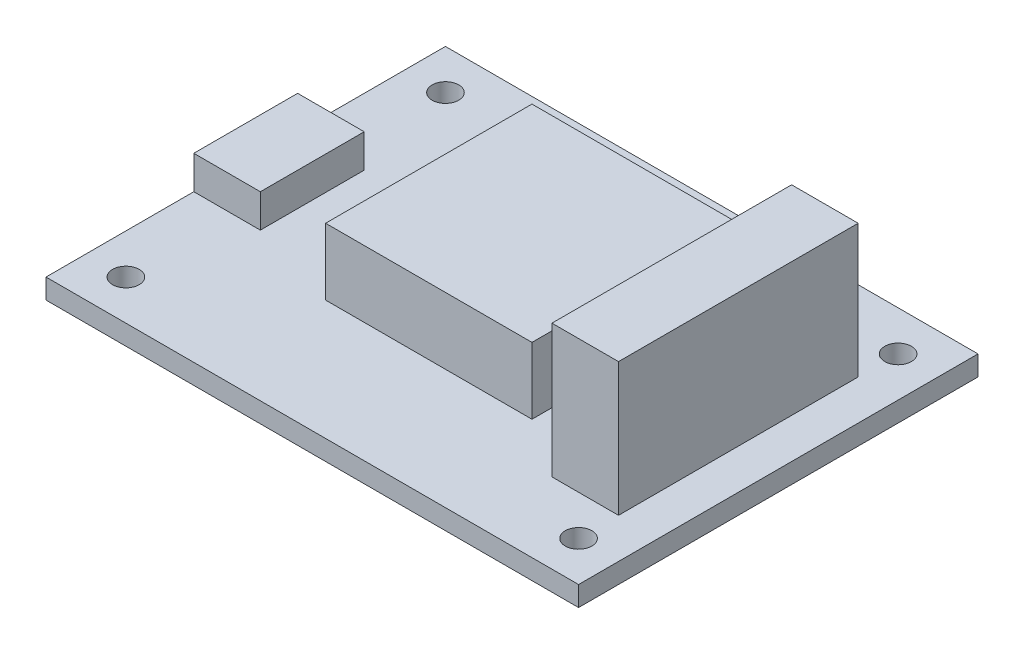
ISO-10303-21;
HEADER;
FILE_DESCRIPTION(('STEP AP214'),'2;1');
FILE_NAME('part.step','',(''),(''),'','','');
FILE_SCHEMA(('AUTOMOTIVE_DESIGN { 1 0 10303 214 1 1 1 1 }'));
ENDSEC;
DATA;
#1=APPLICATION_CONTEXT('core data for automotive mechanical design processes');
#2=APPLICATION_PROTOCOL_DEFINITION('international standard','automotive_design',2000,#1);
#3=PRODUCT_CONTEXT('',#1,'mechanical');
#4=PRODUCT('Part','Part','',(#3));
#5=PRODUCT_RELATED_PRODUCT_CATEGORY('part','',(#4));
#6=PRODUCT_DEFINITION_FORMATION('','',#4);
#7=PRODUCT_DEFINITION_CONTEXT('part definition',#1,'design');
#8=PRODUCT_DEFINITION('design','',#6,#7);
#9=PRODUCT_DEFINITION_SHAPE('','',#8);
#10=(LENGTH_UNIT() NAMED_UNIT(*) SI_UNIT(.MILLI.,.METRE.));
#11=(NAMED_UNIT(*) PLANE_ANGLE_UNIT() SI_UNIT($,.RADIAN.));
#12=(NAMED_UNIT(*) SI_UNIT($,.STERADIAN.) SOLID_ANGLE_UNIT());
#13=UNCERTAINTY_MEASURE_WITH_UNIT(LENGTH_MEASURE(1.E-05),#10,'distance_accuracy_value','');
#14=(GEOMETRIC_REPRESENTATION_CONTEXT(3) GLOBAL_UNCERTAINTY_ASSIGNED_CONTEXT((#13)) GLOBAL_UNIT_ASSIGNED_CONTEXT((#10,
#11,#12)) REPRESENTATION_CONTEXT('',''));
#15=CARTESIAN_POINT('',(0.,0.,0.));
#16=DIRECTION('',(0.,0.,1.));
#17=DIRECTION('',(1.,0.,0.));
#18=AXIS2_PLACEMENT_3D('',#15,#16,#17);
#19=CARTESIAN_POINT('',(0.,1.5,0.));
#20=DIRECTION('',(0.,-1.,0.));
#21=DIRECTION('',(0.,0.,-1.));
#22=AXIS2_PLACEMENT_3D('',#19,#20,#21);
#23=PLANE('',#22);
#24=DIRECTION('',(0.,0.,1.));
#25=VECTOR('',#24,1.);
#26=CARTESIAN_POINT('',(-8.,1.5,-9.5));
#27=LINE('',#26,#25);
#28=CARTESIAN_POINT('',(-8.,1.5,-9.5));
#29=VERTEX_POINT('',#28);
#30=CARTESIAN_POINT('',(-7.99999999999999,1.5,6.));
#31=VERTEX_POINT('',#30);
#32=EDGE_CURVE('E170',#29,#31,#27,.T.);
#33=ORIENTED_EDGE('',*,*,#32,.F.);
#34=DIRECTION('',(-1.,0.,0.));
#35=VECTOR('',#34,1.);
#36=CARTESIAN_POINT('',(-8.,1.5,-9.5));
#37=LINE('',#36,#35);
#38=CARTESIAN_POINT('',(7.5,1.5,-9.5));
#39=VERTEX_POINT('',#38);
#40=EDGE_CURVE('E183',#39,#29,#37,.T.);
#41=ORIENTED_EDGE('',*,*,#40,.F.);
#42=DIRECTION('',(0.,0.,-1.));
#43=VECTOR('',#42,1.);
#44=CARTESIAN_POINT('',(7.5,1.5,-9.5));
#45=LINE('',#44,#43);
#46=CARTESIAN_POINT('',(7.50000000000001,1.5,6.));
#47=VERTEX_POINT('',#46);
#48=EDGE_CURVE('E192',#47,#39,#45,.T.);
#49=ORIENTED_EDGE('',*,*,#48,.F.);
#50=DIRECTION('',(1.,0.,0.));
#51=VECTOR('',#50,1.);
#52=CARTESIAN_POINT('',(-7.99999999999999,1.5,6.));
#53=LINE('',#52,#51);
#54=EDGE_CURVE('E173',#31,#47,#53,.T.);
#55=ORIENTED_EDGE('',*,*,#54,.F.);
#56=EDGE_LOOP('',(#33,#41,#49,#55));
#57=FACE_BOUND('',#56,.T.);
#58=CARTESIAN_POINT('',(-17.,1.5,12.));
#59=DIRECTION('',(0.,1.,0.));
#60=DIRECTION('',(0.,0.,-1.));
#61=AXIS2_PLACEMENT_3D('',#58,#59,#60);
#62=CIRCLE('',#61,1.);
#63=CARTESIAN_POINT('',(-17.,1.5,11.));
#64=VERTEX_POINT('',#63);
#65=EDGE_CURVE('E239',#64,#64,#62,.T.);
#66=ORIENTED_EDGE('',*,*,#65,.F.);
#67=EDGE_LOOP('',(#66));
#68=FACE_BOUND('',#67,.T.);
#69=CARTESIAN_POINT('',(17.,1.5,12.));
#70=DIRECTION('',(0.,1.,0.));
#71=DIRECTION('',(0.,0.,1.));
#72=AXIS2_PLACEMENT_3D('',#69,#70,#71);
#73=CIRCLE('',#72,1.);
#74=CARTESIAN_POINT('',(17.,1.5,13.));
#75=VERTEX_POINT('',#74);
#76=EDGE_CURVE('E245',#75,#75,#73,.T.);
#77=ORIENTED_EDGE('',*,*,#76,.F.);
#78=EDGE_LOOP('',(#77));
#79=FACE_BOUND('',#78,.T.);
#80=CARTESIAN_POINT('',(17.,1.5,-12.));
#81=DIRECTION('',(0.,1.,0.));
#82=DIRECTION('',(0.,0.,-1.));
#83=AXIS2_PLACEMENT_3D('',#80,#81,#82);
#84=CIRCLE('',#83,1.);
#85=CARTESIAN_POINT('',(17.,1.5,-13.));
#86=VERTEX_POINT('',#85);
#87=EDGE_CURVE('E251',#86,#86,#84,.T.);
#88=ORIENTED_EDGE('',*,*,#87,.F.);
#89=EDGE_LOOP('',(#88));
#90=FACE_BOUND('',#89,.T.);
#91=CARTESIAN_POINT('',(-17.,1.5,-12.));
#92=DIRECTION('',(0.,1.,0.));
#93=DIRECTION('',(0.,0.,1.));
#94=AXIS2_PLACEMENT_3D('',#91,#92,#93);
#95=CIRCLE('',#94,1.);
#96=CARTESIAN_POINT('',(-17.,1.5,-11.));
#97=VERTEX_POINT('',#96);
#98=EDGE_CURVE('E257',#97,#97,#95,.T.);
#99=ORIENTED_EDGE('',*,*,#98,.F.);
#100=EDGE_LOOP('',(#99));
#101=FACE_BOUND('',#100,.T.);
#102=DIRECTION('',(-1.,0.,0.));
#103=VECTOR('',#102,1.);
#104=CARTESIAN_POINT('',(-20.,1.5,-3.89999999999999));
#105=LINE('',#104,#103);
#106=CARTESIAN_POINT('',(-15.,1.5,-3.90000000000001));
#107=VERTEX_POINT('',#106);
#108=CARTESIAN_POINT('',(-20.,1.5,-3.9));
#109=VERTEX_POINT('',#108);
#110=EDGE_CURVE('E213',#107,#109,#105,.T.);
#111=ORIENTED_EDGE('',*,*,#110,.F.);
#112=DIRECTION('',(0.,0.,-1.));
#113=VECTOR('',#112,1.);
#114=CARTESIAN_POINT('',(-15.,1.5,-3.90000000000001));
#115=LINE('',#114,#113);
#116=CARTESIAN_POINT('',(-15.,1.5,3.89999999999999));
#117=VERTEX_POINT('',#116);
#118=EDGE_CURVE('E222',#117,#107,#115,.T.);
#119=ORIENTED_EDGE('',*,*,#118,.F.);
#120=DIRECTION('',(1.,0.,0.));
#121=VECTOR('',#120,1.);
#122=CARTESIAN_POINT('',(-20.,1.5,3.89999999999999));
#123=LINE('',#122,#121);
#124=CARTESIAN_POINT('',(-20.,1.5,3.89999999999999));
#125=VERTEX_POINT('',#124);
#126=EDGE_CURVE('E208',#125,#117,#123,.T.);
#127=ORIENTED_EDGE('',*,*,#126,.F.);
#128=DIRECTION('',(0.,0.,1.));
#129=VECTOR('',#128,1.);
#130=CARTESIAN_POINT('',(-20.,1.5,15.));
#131=LINE('',#130,#129);
#132=CARTESIAN_POINT('',(-20.,1.5,15.));
#133=VERTEX_POINT('',#132);
#134=EDGE_CURVE('E269',#125,#133,#131,.T.);
#135=ORIENTED_EDGE('',*,*,#134,.T.);
#136=DIRECTION('',(1.,0.,0.));
#137=VECTOR('',#136,1.);
#138=CARTESIAN_POINT('',(-20.,1.5,15.));
#139=LINE('',#138,#137);
#140=CARTESIAN_POINT('',(20.,1.5,15.));
#141=VERTEX_POINT('',#140);
#142=EDGE_CURVE('E272',#133,#141,#139,.T.);
#143=ORIENTED_EDGE('',*,*,#142,.T.);
#144=DIRECTION('',(0.,0.,-1.));
#145=VECTOR('',#144,1.);
#146=CARTESIAN_POINT('',(20.,1.5,15.));
#147=LINE('',#146,#145);
#148=CARTESIAN_POINT('',(20.,1.5,-15.));
#149=VERTEX_POINT('',#148);
#150=EDGE_CURVE('E263',#141,#149,#147,.T.);
#151=ORIENTED_EDGE('',*,*,#150,.T.);
#152=DIRECTION('',(-1.,0.,0.));
#153=VECTOR('',#152,1.);
#154=CARTESIAN_POINT('',(-20.,1.5,-15.));
#155=LINE('',#154,#153);
#156=CARTESIAN_POINT('',(-20.,1.5,-15.));
#157=VERTEX_POINT('',#156);
#158=EDGE_CURVE('E266',#149,#157,#155,.T.);
#159=ORIENTED_EDGE('',*,*,#158,.T.);
#160=EDGE_CURVE('E270',#157,#109,#131,.T.);
#161=ORIENTED_EDGE('',*,*,#160,.T.);
#162=EDGE_LOOP('',(#111,#119,#127,#135,#143,#151,#159,#161));
#163=FACE_BOUND('',#162,.T.);
#164=DIRECTION('',(0.,0.,1.));
#165=VECTOR('',#164,1.);
#166=CARTESIAN_POINT('',(12.,1.5,-9.));
#167=LINE('',#166,#165);
#168=CARTESIAN_POINT('',(12.,1.5,-9.));
#169=VERTEX_POINT('',#168);
#170=CARTESIAN_POINT('',(12.,1.5,9.));
#171=VERTEX_POINT('',#170);
#172=EDGE_CURVE('E169',#169,#171,#167,.T.);
#173=ORIENTED_EDGE('',*,*,#172,.F.);
#174=DIRECTION('',(-1.,0.,0.));
#175=VECTOR('',#174,1.);
#176=CARTESIAN_POINT('',(12.,1.5,-9.));
#177=LINE('',#176,#175);
#178=CARTESIAN_POINT('',(17.,1.5,-9.));
#179=VERTEX_POINT('',#178);
#180=EDGE_CURVE('E166',#179,#169,#177,.T.);
#181=ORIENTED_EDGE('',*,*,#180,.F.);
#182=DIRECTION('',(0.,0.,-1.));
#183=VECTOR('',#182,1.);
#184=CARTESIAN_POINT('',(17.,1.5,-9.));
#185=LINE('',#184,#183);
#186=CARTESIAN_POINT('',(17.,1.5,9.));
#187=VERTEX_POINT('',#186);
#188=EDGE_CURVE('E56',#187,#179,#185,.T.);
#189=ORIENTED_EDGE('',*,*,#188,.F.);
#190=DIRECTION('',(1.,0.,0.));
#191=VECTOR('',#190,1.);
#192=CARTESIAN_POINT('',(12.,1.5,9.));
#193=LINE('',#192,#191);
#194=EDGE_CURVE('E51',#171,#187,#193,.T.);
#195=ORIENTED_EDGE('',*,*,#194,.F.);
#196=EDGE_LOOP('',(#173,#181,#189,#195));
#197=FACE_BOUND('',#196,.T.);
#198=ADVANCED_FACE('F36',(#57,#68,#79,#90,#101,#163,#197),#23,.F.);
#199=CARTESIAN_POINT('',(0.,0.,0.));
#200=DIRECTION('',(0.,-1.,0.));
#201=DIRECTION('',(0.,0.,-1.));
#202=AXIS2_PLACEMENT_3D('',#199,#200,#201);
#203=PLANE('',#202);
#204=CARTESIAN_POINT('',(17.,0.,12.));
#205=DIRECTION('',(0.,1.,0.));
#206=DIRECTION('',(0.,0.,1.));
#207=AXIS2_PLACEMENT_3D('',#204,#205,#206);
#208=CIRCLE('',#207,1.);
#209=CARTESIAN_POINT('',(17.,0.,13.));
#210=VERTEX_POINT('',#209);
#211=EDGE_CURVE('E242',#210,#210,#208,.T.);
#212=ORIENTED_EDGE('',*,*,#211,.T.);
#213=EDGE_LOOP('',(#212));
#214=FACE_BOUND('',#213,.T.);
#215=CARTESIAN_POINT('',(-17.,0.,-12.));
#216=DIRECTION('',(0.,1.,0.));
#217=DIRECTION('',(0.,0.,1.));
#218=AXIS2_PLACEMENT_3D('',#215,#216,#217);
#219=CIRCLE('',#218,1.);
#220=CARTESIAN_POINT('',(-17.,0.,-11.));
#221=VERTEX_POINT('',#220);
#222=EDGE_CURVE('E254',#221,#221,#219,.T.);
#223=ORIENTED_EDGE('',*,*,#222,.T.);
#224=EDGE_LOOP('',(#223));
#225=FACE_BOUND('',#224,.T.);
#226=DIRECTION('',(0.,0.,-1.));
#227=VECTOR('',#226,1.);
#228=CARTESIAN_POINT('',(20.,0.,15.));
#229=LINE('',#228,#227);
#230=CARTESIAN_POINT('',(20.,0.,15.));
#231=VERTEX_POINT('',#230);
#232=CARTESIAN_POINT('',(20.,0.,-15.));
#233=VERTEX_POINT('',#232);
#234=EDGE_CURVE('E260',#231,#233,#229,.T.);
#235=ORIENTED_EDGE('',*,*,#234,.F.);
#236=DIRECTION('',(1.,0.,0.));
#237=VECTOR('',#236,1.);
#238=CARTESIAN_POINT('',(-20.,0.,15.));
#239=LINE('',#238,#237);
#240=CARTESIAN_POINT('',(-20.,0.,15.));
#241=VERTEX_POINT('',#240);
#242=EDGE_CURVE('E267',#241,#231,#239,.T.);
#243=ORIENTED_EDGE('',*,*,#242,.F.);
#244=DIRECTION('',(0.,0.,1.));
#245=VECTOR('',#244,1.);
#246=CARTESIAN_POINT('',(-20.,0.,15.));
#247=LINE('',#246,#245);
#248=CARTESIAN_POINT('',(-20.,0.,-15.));
#249=VERTEX_POINT('',#248);
#250=EDGE_CURVE('E279',#249,#241,#247,.T.);
#251=ORIENTED_EDGE('',*,*,#250,.F.);
#252=DIRECTION('',(-1.,0.,0.));
#253=VECTOR('',#252,1.);
#254=CARTESIAN_POINT('',(-20.,0.,-15.));
#255=LINE('',#254,#253);
#256=EDGE_CURVE('E277',#233,#249,#255,.T.);
#257=ORIENTED_EDGE('',*,*,#256,.F.);
#258=EDGE_LOOP('',(#235,#243,#251,#257));
#259=FACE_BOUND('',#258,.T.);
#260=CARTESIAN_POINT('',(17.,0.,-12.));
#261=DIRECTION('',(0.,1.,0.));
#262=DIRECTION('',(0.,0.,-1.));
#263=AXIS2_PLACEMENT_3D('',#260,#261,#262);
#264=CIRCLE('',#263,1.);
#265=CARTESIAN_POINT('',(17.,0.,-13.));
#266=VERTEX_POINT('',#265);
#267=EDGE_CURVE('E248',#266,#266,#264,.T.);
#268=ORIENTED_EDGE('',*,*,#267,.T.);
#269=EDGE_LOOP('',(#268));
#270=FACE_BOUND('',#269,.T.);
#271=CARTESIAN_POINT('',(-17.,0.,12.));
#272=DIRECTION('',(0.,1.,0.));
#273=DIRECTION('',(0.,0.,-1.));
#274=AXIS2_PLACEMENT_3D('',#271,#272,#273);
#275=CIRCLE('',#274,1.);
#276=CARTESIAN_POINT('',(-17.,0.,11.));
#277=VERTEX_POINT('',#276);
#278=EDGE_CURVE('E238',#277,#277,#275,.T.);
#279=ORIENTED_EDGE('',*,*,#278,.T.);
#280=EDGE_LOOP('',(#279));
#281=FACE_BOUND('',#280,.T.);
#282=ADVANCED_FACE('F297',(#214,#225,#259,#270,#281),#203,.T.);
#283=CARTESIAN_POINT('',(20.,1.5,15.));
#284=DIRECTION('',(-1.,0.,0.));
#285=DIRECTION('',(0.,0.,1.));
#286=AXIS2_PLACEMENT_3D('',#283,#284,#285);
#287=PLANE('',#286);
#288=ORIENTED_EDGE('',*,*,#234,.T.);
#289=DIRECTION('',(0.,-1.,0.));
#290=VECTOR('',#289,1.);
#291=CARTESIAN_POINT('',(20.,1.5,-15.));
#292=LINE('',#291,#290);
#293=EDGE_CURVE('E11',#149,#233,#292,.T.);
#294=ORIENTED_EDGE('',*,*,#293,.F.);
#295=ORIENTED_EDGE('',*,*,#150,.F.);
#296=DIRECTION('',(0.,-1.,0.));
#297=VECTOR('',#296,1.);
#298=CARTESIAN_POINT('',(20.,1.5,15.));
#299=LINE('',#298,#297);
#300=EDGE_CURVE('E274',#141,#231,#299,.T.);
#301=ORIENTED_EDGE('',*,*,#300,.T.);
#302=EDGE_LOOP('',(#288,#294,#295,#301));
#303=FACE_BOUND('',#302,.T.);
#304=ADVANCED_FACE('F38',(#303),#287,.F.);
#305=CARTESIAN_POINT('',(-20.,1.5,-15.));
#306=DIRECTION('',(0.,0.,1.));
#307=DIRECTION('',(1.,0.,0.));
#308=AXIS2_PLACEMENT_3D('',#305,#306,#307);
#309=PLANE('',#308);
#310=ORIENTED_EDGE('',*,*,#256,.T.);
#311=DIRECTION('',(0.,-1.,0.));
#312=VECTOR('',#311,1.);
#313=CARTESIAN_POINT('',(-20.,1.5,-15.));
#314=LINE('',#313,#312);
#315=EDGE_CURVE('E44',#157,#249,#314,.T.);
#316=ORIENTED_EDGE('',*,*,#315,.F.);
#317=ORIENTED_EDGE('',*,*,#158,.F.);
#318=ORIENTED_EDGE('',*,*,#293,.T.);
#319=EDGE_LOOP('',(#310,#316,#317,#318));
#320=FACE_BOUND('',#319,.T.);
#321=ADVANCED_FACE('F348',(#320),#309,.F.);
#322=CARTESIAN_POINT('',(-20.,1.5,15.));
#323=DIRECTION('',(1.,0.,0.));
#324=DIRECTION('',(0.,0.,-1.));
#325=AXIS2_PLACEMENT_3D('',#322,#323,#324);
#326=PLANE('',#325);
#327=ORIENTED_EDGE('',*,*,#250,.T.);
#328=DIRECTION('',(0.,-1.,0.));
#329=VECTOR('',#328,1.);
#330=CARTESIAN_POINT('',(-20.,1.5,15.));
#331=LINE('',#330,#329);
#332=EDGE_CURVE('E284',#133,#241,#331,.T.);
#333=ORIENTED_EDGE('',*,*,#332,.F.);
#334=ORIENTED_EDGE('',*,*,#134,.F.);
#335=DIRECTION('',(0.,-1.,0.));
#336=VECTOR('',#335,1.);
#337=CARTESIAN_POINT('',(-20.,4.,3.89999999999999));
#338=LINE('',#337,#336);
#339=CARTESIAN_POINT('',(-20.,4.,3.89999999999999));
#340=VERTEX_POINT('',#339);
#341=EDGE_CURVE('E235',#340,#125,#338,.T.);
#342=ORIENTED_EDGE('',*,*,#341,.F.);
#343=DIRECTION('',(0.,0.,1.));
#344=VECTOR('',#343,1.);
#345=CARTESIAN_POINT('',(-20.,4.,-3.89999999999999));
#346=LINE('',#345,#344);
#347=CARTESIAN_POINT('',(-20.,4.,-3.89999999999999));
#348=VERTEX_POINT('',#347);
#349=EDGE_CURVE('E209',#348,#340,#346,.T.);
#350=ORIENTED_EDGE('',*,*,#349,.F.);
#351=DIRECTION('',(0.,-1.,0.));
#352=VECTOR('',#351,1.);
#353=CARTESIAN_POINT('',(-20.,4.,-3.89999999999999));
#354=LINE('',#353,#352);
#355=EDGE_CURVE('E219',#348,#109,#354,.T.);
#356=ORIENTED_EDGE('',*,*,#355,.T.);
#357=ORIENTED_EDGE('',*,*,#160,.F.);
#358=ORIENTED_EDGE('',*,*,#315,.T.);
#359=EDGE_LOOP('',(#327,#333,#334,#342,#350,#356,#357,#358));
#360=FACE_BOUND('',#359,.T.);
#361=ADVANCED_FACE('F291',(#360),#326,.F.);
#362=CARTESIAN_POINT('',(-20.,1.5,15.));
#363=DIRECTION('',(0.,0.,-1.));
#364=DIRECTION('',(-1.,0.,0.));
#365=AXIS2_PLACEMENT_3D('',#362,#363,#364);
#366=PLANE('',#365);
#367=ORIENTED_EDGE('',*,*,#242,.T.);
#368=ORIENTED_EDGE('',*,*,#300,.F.);
#369=ORIENTED_EDGE('',*,*,#142,.F.);
#370=ORIENTED_EDGE('',*,*,#332,.T.);
#371=EDGE_LOOP('',(#367,#368,#369,#370));
#372=FACE_BOUND('',#371,.T.);
#373=ADVANCED_FACE('F301',(#372),#366,.F.);
#374=CARTESIAN_POINT('',(-17.,1.5,-12.));
#375=DIRECTION('',(0.,-1.,0.));
#376=DIRECTION('',(0.,0.,-1.));
#377=AXIS2_PLACEMENT_3D('',#374,#375,#376);
#378=CYLINDRICAL_SURFACE('',#377,1.);
#379=ORIENTED_EDGE('',*,*,#98,.T.);
#380=EDGE_LOOP('',(#379));
#381=FACE_BOUND('',#380,.T.);
#382=ORIENTED_EDGE('',*,*,#222,.F.);
#383=EDGE_LOOP('',(#382));
#384=FACE_BOUND('',#383,.T.);
#385=ADVANCED_FACE('F342',(#381,#384),#378,.F.);
#386=CARTESIAN_POINT('',(17.,1.5,-12.));
#387=DIRECTION('',(0.,-1.,0.));
#388=DIRECTION('',(0.,0.,-1.));
#389=AXIS2_PLACEMENT_3D('',#386,#387,#388);
#390=CYLINDRICAL_SURFACE('',#389,1.);
#391=ORIENTED_EDGE('',*,*,#87,.T.);
#392=EDGE_LOOP('',(#391));
#393=FACE_BOUND('',#392,.T.);
#394=ORIENTED_EDGE('',*,*,#267,.F.);
#395=EDGE_LOOP('',(#394));
#396=FACE_BOUND('',#395,.T.);
#397=ADVANCED_FACE('F389',(#393,#396),#390,.F.);
#398=CARTESIAN_POINT('',(17.,1.5,12.));
#399=DIRECTION('',(0.,-1.,0.));
#400=DIRECTION('',(0.,0.,-1.));
#401=AXIS2_PLACEMENT_3D('',#398,#399,#400);
#402=CYLINDRICAL_SURFACE('',#401,1.);
#403=ORIENTED_EDGE('',*,*,#76,.T.);
#404=EDGE_LOOP('',(#403));
#405=FACE_BOUND('',#404,.T.);
#406=ORIENTED_EDGE('',*,*,#211,.F.);
#407=EDGE_LOOP('',(#406));
#408=FACE_BOUND('',#407,.T.);
#409=ADVANCED_FACE('F397',(#405,#408),#402,.F.);
#410=CARTESIAN_POINT('',(-17.,1.5,12.));
#411=DIRECTION('',(0.,-1.,0.));
#412=DIRECTION('',(0.,0.,-1.));
#413=AXIS2_PLACEMENT_3D('',#410,#411,#412);
#414=CYLINDRICAL_SURFACE('',#413,1.);
#415=ORIENTED_EDGE('',*,*,#65,.T.);
#416=EDGE_LOOP('',(#415));
#417=FACE_BOUND('',#416,.T.);
#418=ORIENTED_EDGE('',*,*,#278,.F.);
#419=EDGE_LOOP('',(#418));
#420=FACE_BOUND('',#419,.T.);
#421=ADVANCED_FACE('F330',(#417,#420),#414,.F.);
#422=CARTESIAN_POINT('',(-20.,4.,3.89999999999999));
#423=DIRECTION('',(0.,0.,-1.));
#424=DIRECTION('',(-1.,0.,0.));
#425=AXIS2_PLACEMENT_3D('',#422,#423,#424);
#426=PLANE('',#425);
#427=ORIENTED_EDGE('',*,*,#126,.T.);
#428=DIRECTION('',(0.,-1.,0.));
#429=VECTOR('',#428,1.);
#430=CARTESIAN_POINT('',(-15.,4.,3.89999999999999));
#431=LINE('',#430,#429);
#432=CARTESIAN_POINT('',(-15.,4.,3.89999999999999));
#433=VERTEX_POINT('',#432);
#434=EDGE_CURVE('E232',#433,#117,#431,.T.);
#435=ORIENTED_EDGE('',*,*,#434,.F.);
#436=DIRECTION('',(1.,0.,0.));
#437=VECTOR('',#436,1.);
#438=CARTESIAN_POINT('',(-20.,4.,3.89999999999999));
#439=LINE('',#438,#437);
#440=EDGE_CURVE('E212',#340,#433,#439,.T.);
#441=ORIENTED_EDGE('',*,*,#440,.F.);
#442=ORIENTED_EDGE('',*,*,#341,.T.);
#443=EDGE_LOOP('',(#427,#435,#441,#442));
#444=FACE_BOUND('',#443,.T.);
#445=ADVANCED_FACE('F311',(#444),#426,.F.);
#446=CARTESIAN_POINT('',(-15.,4.,-3.90000000000001));
#447=DIRECTION('',(-1.,0.,0.));
#448=DIRECTION('',(0.,0.,1.));
#449=AXIS2_PLACEMENT_3D('',#446,#447,#448);
#450=PLANE('',#449);
#451=ORIENTED_EDGE('',*,*,#118,.T.);
#452=DIRECTION('',(0.,-1.,0.));
#453=VECTOR('',#452,1.);
#454=CARTESIAN_POINT('',(-15.,4.,-3.90000000000001));
#455=LINE('',#454,#453);
#456=CARTESIAN_POINT('',(-15.,4.,-3.90000000000001));
#457=VERTEX_POINT('',#456);
#458=EDGE_CURVE('E229',#457,#107,#455,.T.);
#459=ORIENTED_EDGE('',*,*,#458,.F.);
#460=DIRECTION('',(0.,0.,-1.));
#461=VECTOR('',#460,1.);
#462=CARTESIAN_POINT('',(-15.,4.,-3.90000000000001));
#463=LINE('',#462,#461);
#464=EDGE_CURVE('E215',#433,#457,#463,.T.);
#465=ORIENTED_EDGE('',*,*,#464,.F.);
#466=ORIENTED_EDGE('',*,*,#434,.T.);
#467=EDGE_LOOP('',(#451,#459,#465,#466));
#468=FACE_BOUND('',#467,.T.);
#469=ADVANCED_FACE('F322',(#468),#450,.F.);
#470=CARTESIAN_POINT('',(-20.,4.,-3.89999999999999));
#471=DIRECTION('',(0.,0.,1.));
#472=DIRECTION('',(1.,0.,0.));
#473=AXIS2_PLACEMENT_3D('',#470,#471,#472);
#474=PLANE('',#473);
#475=ORIENTED_EDGE('',*,*,#110,.T.);
#476=ORIENTED_EDGE('',*,*,#355,.F.);
#477=DIRECTION('',(-1.,0.,0.));
#478=VECTOR('',#477,1.);
#479=CARTESIAN_POINT('',(-20.,4.,-3.89999999999999));
#480=LINE('',#479,#478);
#481=EDGE_CURVE('E217',#457,#348,#480,.T.);
#482=ORIENTED_EDGE('',*,*,#481,.F.);
#483=ORIENTED_EDGE('',*,*,#458,.T.);
#484=EDGE_LOOP('',(#475,#476,#482,#483));
#485=FACE_BOUND('',#484,.T.);
#486=ADVANCED_FACE('F319',(#485),#474,.F.);
#487=CARTESIAN_POINT('',(0.,4.,0.));
#488=DIRECTION('',(0.,1.,0.));
#489=DIRECTION('',(0.,0.,1.));
#490=AXIS2_PLACEMENT_3D('',#487,#488,#489);
#491=PLANE('',#490);
#492=ORIENTED_EDGE('',*,*,#349,.T.);
#493=ORIENTED_EDGE('',*,*,#440,.T.);
#494=ORIENTED_EDGE('',*,*,#464,.T.);
#495=ORIENTED_EDGE('',*,*,#481,.T.);
#496=EDGE_LOOP('',(#492,#493,#494,#495));
#497=FACE_BOUND('',#496,.T.);
#498=ADVANCED_FACE('F315',(#497),#491,.T.);
#499=CARTESIAN_POINT('',(-8.,6.5,-9.5));
#500=DIRECTION('',(1.,0.,0.));
#501=DIRECTION('',(0.,0.,-1.));
#502=AXIS2_PLACEMENT_3D('',#499,#500,#501);
#503=PLANE('',#502);
#504=ORIENTED_EDGE('',*,*,#32,.T.);
#505=DIRECTION('',(0.,-1.,0.));
#506=VECTOR('',#505,1.);
#507=CARTESIAN_POINT('',(-7.99999999999999,6.5,6.));
#508=LINE('',#507,#506);
#509=CARTESIAN_POINT('',(-7.99999999999999,6.5,6.));
#510=VERTEX_POINT('',#509);
#511=EDGE_CURVE('E205',#510,#31,#508,.T.);
#512=ORIENTED_EDGE('',*,*,#511,.F.);
#513=DIRECTION('',(0.,0.,1.));
#514=VECTOR('',#513,1.);
#515=CARTESIAN_POINT('',(-8.,6.5,-9.5));
#516=LINE('',#515,#514);
#517=CARTESIAN_POINT('',(-8.,6.5,-9.5));
#518=VERTEX_POINT('',#517);
#519=EDGE_CURVE('E179',#518,#510,#516,.T.);
#520=ORIENTED_EDGE('',*,*,#519,.F.);
#521=DIRECTION('',(0.,-1.,0.));
#522=VECTOR('',#521,1.);
#523=CARTESIAN_POINT('',(-8.,6.5,-9.5));
#524=LINE('',#523,#522);
#525=EDGE_CURVE('E188',#518,#29,#524,.T.);
#526=ORIENTED_EDGE('',*,*,#525,.T.);
#527=EDGE_LOOP('',(#504,#512,#520,#526));
#528=FACE_BOUND('',#527,.T.);
#529=ADVANCED_FACE('F437',(#528),#503,.F.);
#530=CARTESIAN_POINT('',(-7.99999999999999,6.5,6.));
#531=DIRECTION('',(0.,0.,-1.));
#532=DIRECTION('',(-1.,0.,0.));
#533=AXIS2_PLACEMENT_3D('',#530,#531,#532);
#534=PLANE('',#533);
#535=ORIENTED_EDGE('',*,*,#54,.T.);
#536=DIRECTION('',(0.,-1.,0.));
#537=VECTOR('',#536,1.);
#538=CARTESIAN_POINT('',(7.50000000000001,6.5,6.));
#539=LINE('',#538,#537);
#540=CARTESIAN_POINT('',(7.50000000000001,6.5,6.));
#541=VERTEX_POINT('',#540);
#542=EDGE_CURVE('E202',#541,#47,#539,.T.);
#543=ORIENTED_EDGE('',*,*,#542,.F.);
#544=DIRECTION('',(1.,0.,0.));
#545=VECTOR('',#544,1.);
#546=CARTESIAN_POINT('',(-7.99999999999999,6.5,6.));
#547=LINE('',#546,#545);
#548=EDGE_CURVE('E182',#510,#541,#547,.T.);
#549=ORIENTED_EDGE('',*,*,#548,.F.);
#550=ORIENTED_EDGE('',*,*,#511,.T.);
#551=EDGE_LOOP('',(#535,#543,#549,#550));
#552=FACE_BOUND('',#551,.T.);
#553=ADVANCED_FACE('F446',(#552),#534,.F.);
#554=CARTESIAN_POINT('',(7.5,6.5,-9.5));
#555=DIRECTION('',(-1.,0.,0.));
#556=DIRECTION('',(0.,0.,1.));
#557=AXIS2_PLACEMENT_3D('',#554,#555,#556);
#558=PLANE('',#557);
#559=ORIENTED_EDGE('',*,*,#48,.T.);
#560=DIRECTION('',(0.,-1.,0.));
#561=VECTOR('',#560,1.);
#562=CARTESIAN_POINT('',(7.5,6.5,-9.5));
#563=LINE('',#562,#561);
#564=CARTESIAN_POINT('',(7.5,6.5,-9.5));
#565=VERTEX_POINT('',#564);
#566=EDGE_CURVE('E199',#565,#39,#563,.T.);
#567=ORIENTED_EDGE('',*,*,#566,.F.);
#568=DIRECTION('',(0.,0.,-1.));
#569=VECTOR('',#568,1.);
#570=CARTESIAN_POINT('',(7.5,6.5,-9.5));
#571=LINE('',#570,#569);
#572=EDGE_CURVE('E185',#541,#565,#571,.T.);
#573=ORIENTED_EDGE('',*,*,#572,.F.);
#574=ORIENTED_EDGE('',*,*,#542,.T.);
#575=EDGE_LOOP('',(#559,#567,#573,#574));
#576=FACE_BOUND('',#575,.T.);
#577=ADVANCED_FACE('F456',(#576),#558,.F.);
#578=CARTESIAN_POINT('',(-8.,6.5,-9.5));
#579=DIRECTION('',(0.,0.,1.));
#580=DIRECTION('',(1.,0.,0.));
#581=AXIS2_PLACEMENT_3D('',#578,#579,#580);
#582=PLANE('',#581);
#583=ORIENTED_EDGE('',*,*,#40,.T.);
#584=ORIENTED_EDGE('',*,*,#525,.F.);
#585=DIRECTION('',(-1.,0.,0.));
#586=VECTOR('',#585,1.);
#587=CARTESIAN_POINT('',(-8.,6.5,-9.5));
#588=LINE('',#587,#586);
#589=EDGE_CURVE('E187',#565,#518,#588,.T.);
#590=ORIENTED_EDGE('',*,*,#589,.F.);
#591=ORIENTED_EDGE('',*,*,#566,.T.);
#592=EDGE_LOOP('',(#583,#584,#590,#591));
#593=FACE_BOUND('',#592,.T.);
#594=ADVANCED_FACE('F466',(#593),#582,.F.);
#595=CARTESIAN_POINT('',(0.,6.5,0.));
#596=DIRECTION('',(0.,1.,0.));
#597=DIRECTION('',(0.,0.,1.));
#598=AXIS2_PLACEMENT_3D('',#595,#596,#597);
#599=PLANE('',#598);
#600=ORIENTED_EDGE('',*,*,#519,.T.);
#601=ORIENTED_EDGE('',*,*,#548,.T.);
#602=ORIENTED_EDGE('',*,*,#572,.T.);
#603=ORIENTED_EDGE('',*,*,#589,.T.);
#604=EDGE_LOOP('',(#600,#601,#602,#603));
#605=FACE_BOUND('',#604,.T.);
#606=ADVANCED_FACE('F476',(#605),#599,.T.);
#607=CARTESIAN_POINT('',(12.,11.5,-9.));
#608=DIRECTION('',(1.,0.,0.));
#609=DIRECTION('',(0.,0.,-1.));
#610=AXIS2_PLACEMENT_3D('',#607,#608,#609);
#611=PLANE('',#610);
#612=ORIENTED_EDGE('',*,*,#172,.T.);
#613=DIRECTION('',(0.,-1.,0.));
#614=VECTOR('',#613,1.);
#615=CARTESIAN_POINT('',(12.,11.5,9.));
#616=LINE('',#615,#614);
#617=CARTESIAN_POINT('',(12.,11.5,9.));
#618=VERTEX_POINT('',#617);
#619=EDGE_CURVE('E150',#618,#171,#616,.T.);
#620=ORIENTED_EDGE('',*,*,#619,.F.);
#621=DIRECTION('',(0.,0.,1.));
#622=VECTOR('',#621,1.);
#623=CARTESIAN_POINT('',(12.,11.5,-9.));
#624=LINE('',#623,#622);
#625=CARTESIAN_POINT('',(12.,11.5,-9.));
#626=VERTEX_POINT('',#625);
#627=EDGE_CURVE('E157',#626,#618,#624,.T.);
#628=ORIENTED_EDGE('',*,*,#627,.F.);
#629=DIRECTION('',(0.,-1.,0.));
#630=VECTOR('',#629,1.);
#631=CARTESIAN_POINT('',(12.,11.5,-9.));
#632=LINE('',#631,#630);
#633=EDGE_CURVE('E540',#626,#169,#632,.T.);
#634=ORIENTED_EDGE('',*,*,#633,.T.);
#635=EDGE_LOOP('',(#612,#620,#628,#634));
#636=FACE_BOUND('',#635,.T.);
#637=ADVANCED_FACE('F168',(#636),#611,.F.);
#638=CARTESIAN_POINT('',(12.,11.5,9.));
#639=DIRECTION('',(0.,0.,-1.));
#640=DIRECTION('',(-1.,0.,0.));
#641=AXIS2_PLACEMENT_3D('',#638,#639,#640);
#642=PLANE('',#641);
#643=ORIENTED_EDGE('',*,*,#194,.T.);
#644=DIRECTION('',(0.,-1.,0.));
#645=VECTOR('',#644,1.);
#646=CARTESIAN_POINT('',(17.,11.5,9.));
#647=LINE('',#646,#645);
#648=CARTESIAN_POINT('',(17.,11.5,9.));
#649=VERTEX_POINT('',#648);
#650=EDGE_CURVE('E153',#649,#187,#647,.T.);
#651=ORIENTED_EDGE('',*,*,#650,.F.);
#652=DIRECTION('',(1.,0.,0.));
#653=VECTOR('',#652,1.);
#654=CARTESIAN_POINT('',(12.,11.5,9.));
#655=LINE('',#654,#653);
#656=EDGE_CURVE('E146',#618,#649,#655,.T.);
#657=ORIENTED_EDGE('',*,*,#656,.F.);
#658=ORIENTED_EDGE('',*,*,#619,.T.);
#659=EDGE_LOOP('',(#643,#651,#657,#658));
#660=FACE_BOUND('',#659,.T.);
#661=ADVANCED_FACE('F148',(#660),#642,.F.);
#662=CARTESIAN_POINT('',(17.,11.5,-9.));
#663=DIRECTION('',(-1.,0.,0.));
#664=DIRECTION('',(0.,0.,1.));
#665=AXIS2_PLACEMENT_3D('',#662,#663,#664);
#666=PLANE('',#665);
#667=ORIENTED_EDGE('',*,*,#188,.T.);
#668=DIRECTION('',(0.,-1.,0.));
#669=VECTOR('',#668,1.);
#670=CARTESIAN_POINT('',(17.,11.5,-9.));
#671=LINE('',#670,#669);
#672=CARTESIAN_POINT('',(17.,11.5,-9.));
#673=VERTEX_POINT('',#672);
#674=EDGE_CURVE('E175',#673,#179,#671,.T.);
#675=ORIENTED_EDGE('',*,*,#674,.F.);
#676=DIRECTION('',(0.,0.,-1.));
#677=VECTOR('',#676,1.);
#678=CARTESIAN_POINT('',(17.,11.5,-9.));
#679=LINE('',#678,#677);
#680=EDGE_CURVE('E156',#649,#673,#679,.T.);
#681=ORIENTED_EDGE('',*,*,#680,.F.);
#682=ORIENTED_EDGE('',*,*,#650,.T.);
#683=EDGE_LOOP('',(#667,#675,#681,#682));
#684=FACE_BOUND('',#683,.T.);
#685=ADVANCED_FACE('F507',(#684),#666,.F.);
#686=CARTESIAN_POINT('',(12.,11.5,-9.));
#687=DIRECTION('',(0.,0.,1.));
#688=DIRECTION('',(1.,0.,0.));
#689=AXIS2_PLACEMENT_3D('',#686,#687,#688);
#690=PLANE('',#689);
#691=ORIENTED_EDGE('',*,*,#180,.T.);
#692=ORIENTED_EDGE('',*,*,#633,.F.);
#693=DIRECTION('',(-1.,0.,0.));
#694=VECTOR('',#693,1.);
#695=CARTESIAN_POINT('',(12.,11.5,-9.));
#696=LINE('',#695,#694);
#697=EDGE_CURVE('E162',#673,#626,#696,.T.);
#698=ORIENTED_EDGE('',*,*,#697,.F.);
#699=ORIENTED_EDGE('',*,*,#674,.T.);
#700=EDGE_LOOP('',(#691,#692,#698,#699));
#701=FACE_BOUND('',#700,.T.);
#702=ADVANCED_FACE('F516',(#701),#690,.F.);
#703=CARTESIAN_POINT('',(0.,11.5,0.));
#704=DIRECTION('',(0.,1.,0.));
#705=DIRECTION('',(0.,0.,1.));
#706=AXIS2_PLACEMENT_3D('',#703,#704,#705);
#707=PLANE('',#706);
#708=ORIENTED_EDGE('',*,*,#627,.T.);
#709=ORIENTED_EDGE('',*,*,#656,.T.);
#710=ORIENTED_EDGE('',*,*,#680,.T.);
#711=ORIENTED_EDGE('',*,*,#697,.T.);
#712=EDGE_LOOP('',(#708,#709,#710,#711));
#713=FACE_BOUND('',#712,.T.);
#714=ADVANCED_FACE('F160',(#713),#707,.T.);
#715=CLOSED_SHELL('',(#198,#282,#304,#321,#361,#373,#385,#397,#409,#421,#445,#469,#486,#498,
#529,#553,#577,#594,#606,#637,#661,#685,#702,#714));
#716=MANIFOLD_SOLID_BREP('B2',#715);
#717=ADVANCED_BREP_SHAPE_REPRESENTATION('',(#18,#716),#14);
#718=SHAPE_DEFINITION_REPRESENTATION(#9,#717);
ENDSEC;
END-ISO-10303-21;
